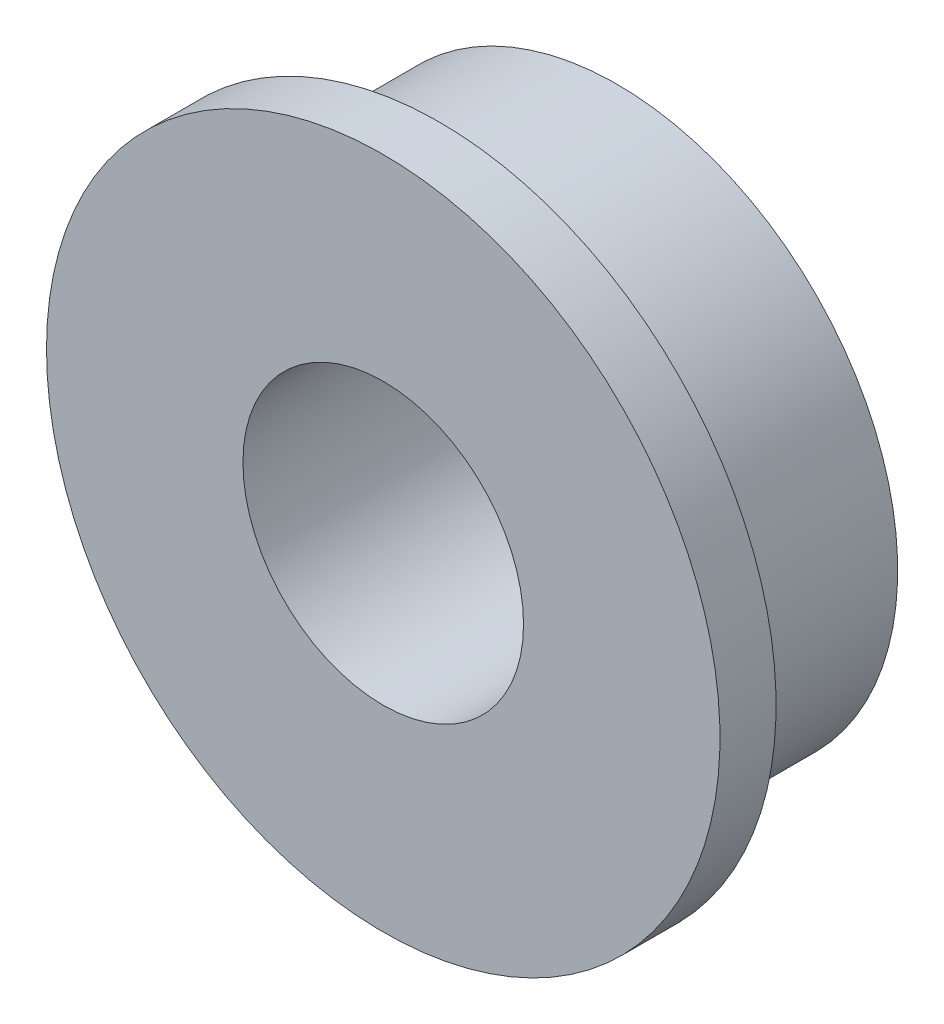
ISO-10303-21;
HEADER;
FILE_DESCRIPTION(('STEP AP214'),'2;1');
FILE_NAME('part.step','',(''),(''),'','','');
FILE_SCHEMA(('AUTOMOTIVE_DESIGN { 1 0 10303 214 1 1 1 1 }'));
ENDSEC;
DATA;
#1=APPLICATION_CONTEXT('core data for automotive mechanical design processes');
#2=APPLICATION_PROTOCOL_DEFINITION('international standard','automotive_design',2000,#1);
#3=PRODUCT_CONTEXT('',#1,'mechanical');
#4=PRODUCT('Part','Part','',(#3));
#5=PRODUCT_RELATED_PRODUCT_CATEGORY('part','',(#4));
#6=PRODUCT_DEFINITION_FORMATION('','',#4);
#7=PRODUCT_DEFINITION_CONTEXT('part definition',#1,'design');
#8=PRODUCT_DEFINITION('design','',#6,#7);
#9=PRODUCT_DEFINITION_SHAPE('','',#8);
#10=(LENGTH_UNIT() NAMED_UNIT(*) SI_UNIT(.MILLI.,.METRE.));
#11=(NAMED_UNIT(*) PLANE_ANGLE_UNIT() SI_UNIT($,.RADIAN.));
#12=(NAMED_UNIT(*) SI_UNIT($,.STERADIAN.) SOLID_ANGLE_UNIT());
#13=UNCERTAINTY_MEASURE_WITH_UNIT(LENGTH_MEASURE(1.E-05),#10,'distance_accuracy_value','');
#14=(GEOMETRIC_REPRESENTATION_CONTEXT(3) GLOBAL_UNCERTAINTY_ASSIGNED_CONTEXT((#13)) GLOBAL_UNIT_ASSIGNED_CONTEXT((#10,
#11,#12)) REPRESENTATION_CONTEXT('',''));
#15=CARTESIAN_POINT('',(0.,0.,0.));
#16=DIRECTION('',(0.,0.,1.));
#17=DIRECTION('',(1.,0.,0.));
#18=AXIS2_PLACEMENT_3D('',#15,#16,#17);
#19=CARTESIAN_POINT('',(3.6,0.,0.));
#20=DIRECTION('',(0.,0.,-1.));
#21=DIRECTION('',(-1.,0.,0.));
#22=AXIS2_PLACEMENT_3D('',#19,#20,#21);
#23=PLANE('',#22);
#24=CARTESIAN_POINT('',(0.,0.,0.));
#25=DIRECTION('',(0.,0.,-1.));
#26=DIRECTION('',(-1.,0.,0.));
#27=AXIS2_PLACEMENT_3D('',#24,#25,#26);
#28=CIRCLE('',#27,3.6);
#29=CARTESIAN_POINT('',(-3.6,0.,0.));
#30=VERTEX_POINT('',#29);
#31=EDGE_CURVE('E54',#30,#30,#28,.T.);
#32=ORIENTED_EDGE('',*,*,#31,.F.);
#33=EDGE_LOOP('',(#32));
#34=FACE_BOUND('',#33,.T.);
#35=CARTESIAN_POINT('',(0.,0.,0.));
#36=DIRECTION('',(0.,0.,-1.));
#37=DIRECTION('',(-1.,0.,0.));
#38=AXIS2_PLACEMENT_3D('',#35,#36,#37);
#39=CIRCLE('',#38,1.5);
#40=CARTESIAN_POINT('',(-1.5,0.,0.));
#41=VERTEX_POINT('',#40);
#42=EDGE_CURVE('E10',#41,#41,#39,.T.);
#43=ORIENTED_EDGE('',*,*,#42,.T.);
#44=EDGE_LOOP('',(#43));
#45=FACE_BOUND('',#44,.T.);
#46=ADVANCED_FACE('F32',(#34,#45),#23,.F.);
#47=CARTESIAN_POINT('',(0.,0.,-3.));
#48=DIRECTION('',(0.,0.,-1.));
#49=DIRECTION('',(-1.,0.,0.));
#50=AXIS2_PLACEMENT_3D('',#47,#48,#49);
#51=CYLINDRICAL_SURFACE('',#50,1.5);
#52=ORIENTED_EDGE('',*,*,#42,.F.);
#53=EDGE_LOOP('',(#52));
#54=FACE_BOUND('',#53,.T.);
#55=CARTESIAN_POINT('',(0.,0.,-2.5));
#56=DIRECTION('',(0.,0.,-1.));
#57=DIRECTION('',(-1.,0.,0.));
#58=AXIS2_PLACEMENT_3D('',#55,#56,#57);
#59=CIRCLE('',#58,1.5);
#60=CARTESIAN_POINT('',(-1.5,0.,-2.5));
#61=VERTEX_POINT('',#60);
#62=EDGE_CURVE('E38',#61,#61,#59,.T.);
#63=ORIENTED_EDGE('',*,*,#62,.T.);
#64=EDGE_LOOP('',(#63));
#65=FACE_BOUND('',#64,.T.);
#66=ADVANCED_FACE('F61',(#54,#65),#51,.F.);
#67=CARTESIAN_POINT('',(1.5,0.,-2.5));
#68=DIRECTION('',(0.,0.,1.));
#69=DIRECTION('',(1.,0.,0.));
#70=AXIS2_PLACEMENT_3D('',#67,#68,#69);
#71=PLANE('',#70);
#72=ORIENTED_EDGE('',*,*,#62,.F.);
#73=EDGE_LOOP('',(#72));
#74=FACE_BOUND('',#73,.T.);
#75=CARTESIAN_POINT('',(0.,0.,-2.5));
#76=DIRECTION('',(0.,0.,-1.));
#77=DIRECTION('',(-1.,0.,0.));
#78=AXIS2_PLACEMENT_3D('',#75,#76,#77);
#79=CIRCLE('',#78,3.);
#80=CARTESIAN_POINT('',(-3.,0.,-2.5));
#81=VERTEX_POINT('',#80);
#82=EDGE_CURVE('E42',#81,#81,#79,.T.);
#83=ORIENTED_EDGE('',*,*,#82,.T.);
#84=EDGE_LOOP('',(#83));
#85=FACE_BOUND('',#84,.T.);
#86=ADVANCED_FACE('F65',(#74,#85),#71,.F.);
#87=CARTESIAN_POINT('',(0.,0.,-3.));
#88=DIRECTION('',(0.,0.,-1.));
#89=DIRECTION('',(-1.,0.,0.));
#90=AXIS2_PLACEMENT_3D('',#87,#88,#89);
#91=CYLINDRICAL_SURFACE('',#90,3.);
#92=ORIENTED_EDGE('',*,*,#82,.F.);
#93=EDGE_LOOP('',(#92));
#94=FACE_BOUND('',#93,.T.);
#95=CARTESIAN_POINT('',(0.,0.,-0.599999999999999));
#96=DIRECTION('',(0.,0.,-1.));
#97=DIRECTION('',(-1.,0.,0.));
#98=AXIS2_PLACEMENT_3D('',#95,#96,#97);
#99=CIRCLE('',#98,3.);
#100=CARTESIAN_POINT('',(-3.,0.,-0.599999999999999));
#101=VERTEX_POINT('',#100);
#102=EDGE_CURVE('E46',#101,#101,#99,.T.);
#103=ORIENTED_EDGE('',*,*,#102,.T.);
#104=EDGE_LOOP('',(#103));
#105=FACE_BOUND('',#104,.T.);
#106=ADVANCED_FACE('F70',(#94,#105),#91,.T.);
#107=CARTESIAN_POINT('',(3.,0.,-0.6));
#108=DIRECTION('',(0.,0.,1.));
#109=DIRECTION('',(1.,0.,0.));
#110=AXIS2_PLACEMENT_3D('',#107,#108,#109);
#111=PLANE('',#110);
#112=ORIENTED_EDGE('',*,*,#102,.F.);
#113=EDGE_LOOP('',(#112));
#114=FACE_BOUND('',#113,.T.);
#115=CARTESIAN_POINT('',(0.,0.,-0.599999999999999));
#116=DIRECTION('',(0.,0.,-1.));
#117=DIRECTION('',(-1.,0.,0.));
#118=AXIS2_PLACEMENT_3D('',#115,#116,#117);
#119=CIRCLE('',#118,3.6);
#120=CARTESIAN_POINT('',(-3.6,0.,-0.599999999999999));
#121=VERTEX_POINT('',#120);
#122=EDGE_CURVE('E51',#121,#121,#119,.T.);
#123=ORIENTED_EDGE('',*,*,#122,.T.);
#124=EDGE_LOOP('',(#123));
#125=FACE_BOUND('',#124,.T.);
#126=ADVANCED_FACE('F76',(#114,#125),#111,.F.);
#127=CARTESIAN_POINT('',(0.,0.,-3.));
#128=DIRECTION('',(0.,0.,-1.));
#129=DIRECTION('',(-1.,0.,0.));
#130=AXIS2_PLACEMENT_3D('',#127,#128,#129);
#131=CYLINDRICAL_SURFACE('',#130,3.6);
#132=ORIENTED_EDGE('',*,*,#122,.F.);
#133=EDGE_LOOP('',(#132));
#134=FACE_BOUND('',#133,.T.);
#135=ORIENTED_EDGE('',*,*,#31,.T.);
#136=EDGE_LOOP('',(#135));
#137=FACE_BOUND('',#136,.T.);
#138=ADVANCED_FACE('F58',(#134,#137),#131,.T.);
#139=CLOSED_SHELL('',(#46,#66,#86,#106,#126,#138));
#140=MANIFOLD_SOLID_BREP('B2',#139);
#141=ADVANCED_BREP_SHAPE_REPRESENTATION('',(#18,#140),#14);
#142=SHAPE_DEFINITION_REPRESENTATION(#9,#141);
ENDSEC;
END-ISO-10303-21;
